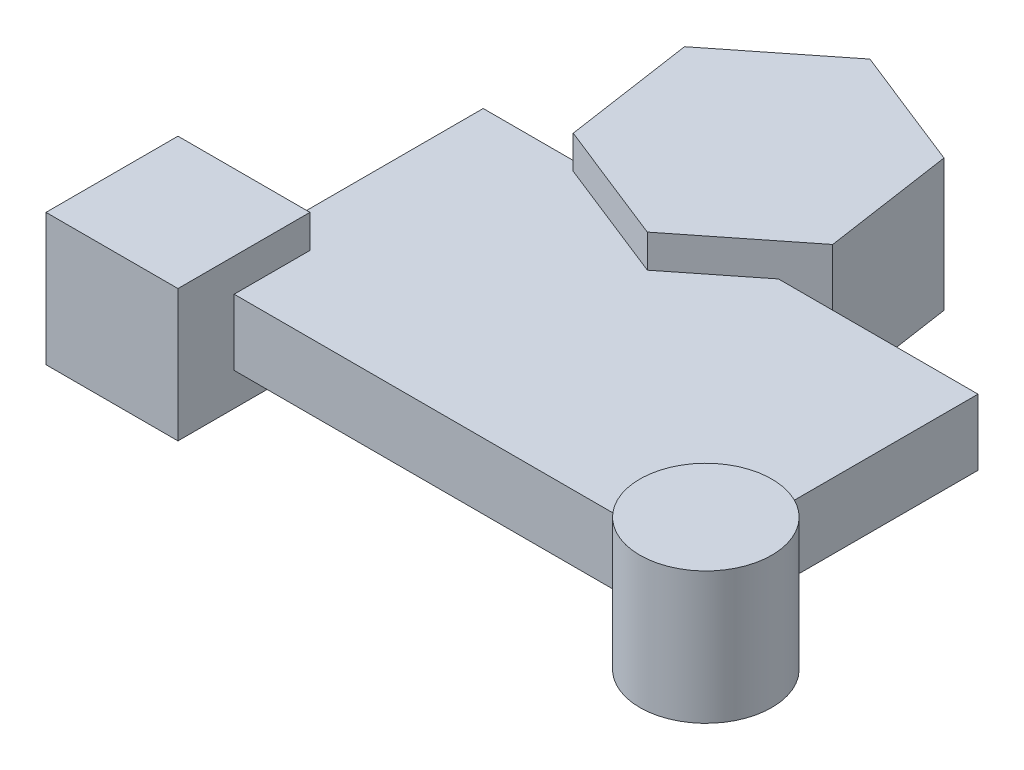
ISO-10303-21;
HEADER;
FILE_DESCRIPTION(('STEP AP214'),'2;1');
FILE_NAME('part.step','',(''),(''),'','','');
FILE_SCHEMA(('AUTOMOTIVE_DESIGN { 1 0 10303 214 1 1 1 1 }'));
ENDSEC;
DATA;
#1=APPLICATION_CONTEXT('core data for automotive mechanical design processes');
#2=APPLICATION_PROTOCOL_DEFINITION('international standard','automotive_design',2000,#1);
#3=PRODUCT_CONTEXT('',#1,'mechanical');
#4=PRODUCT('Part','Part','',(#3));
#5=PRODUCT_RELATED_PRODUCT_CATEGORY('part','',(#4));
#6=PRODUCT_DEFINITION_FORMATION('','',#4);
#7=PRODUCT_DEFINITION_CONTEXT('part definition',#1,'design');
#8=PRODUCT_DEFINITION('design','',#6,#7);
#9=PRODUCT_DEFINITION_SHAPE('','',#8);
#10=(LENGTH_UNIT() NAMED_UNIT(*) SI_UNIT(.MILLI.,.METRE.));
#11=(NAMED_UNIT(*) PLANE_ANGLE_UNIT() SI_UNIT($,.RADIAN.));
#12=(NAMED_UNIT(*) SI_UNIT($,.STERADIAN.) SOLID_ANGLE_UNIT());
#13=UNCERTAINTY_MEASURE_WITH_UNIT(LENGTH_MEASURE(1.E-05),#10,'distance_accuracy_value','');
#14=(GEOMETRIC_REPRESENTATION_CONTEXT(3) GLOBAL_UNCERTAINTY_ASSIGNED_CONTEXT((#13)) GLOBAL_UNIT_ASSIGNED_CONTEXT((#10,
#11,#12)) REPRESENTATION_CONTEXT('',''));
#15=CARTESIAN_POINT('',(0.,0.,0.));
#16=DIRECTION('',(0.,0.,1.));
#17=DIRECTION('',(1.,0.,0.));
#18=AXIS2_PLACEMENT_3D('',#15,#16,#17);
#19=CARTESIAN_POINT('',(4.78052116498155,10.,-15.1706895412915));
#20=DIRECTION('',(0.368239357538517,0.,-0.929731023231784));
#21=DIRECTION('',(-0.929731023231784,0.,-0.368239357538517));
#22=AXIS2_PLACEMENT_3D('',#19,#20,#21);
#23=PLANE('',#22);
#24=DIRECTION('',(0.929731023231784,0.,0.368239357538517));
#25=VECTOR('',#24,1.);
#26=CARTESIAN_POINT('',(4.78052116498155,2.5,-15.1706895412915));
#27=LINE('',#26,#25);
#28=CARTESIAN_POINT('',(4.78052116498155,2.5,-15.1706895412915));
#29=VERTEX_POINT('',#28);
#30=CARTESIAN_POINT('',(14.0778313972994,2.5,-11.4882959659064));
#31=VERTEX_POINT('',#30);
#32=EDGE_CURVE('E64',#29,#31,#27,.T.);
#33=ORIENTED_EDGE('',*,*,#32,.F.);
#34=DIRECTION('',(0.,-1.,0.));
#35=VECTOR('',#34,1.);
#36=CARTESIAN_POINT('',(4.78052116498155,10.,-15.1706895412915));
#37=LINE('',#36,#35);
#38=CARTESIAN_POINT('',(4.78052116498155,0.,-15.1706895412915));
#39=VERTEX_POINT('',#38);
#40=EDGE_CURVE('E138',#29,#39,#37,.T.);
#41=ORIENTED_EDGE('',*,*,#40,.T.);
#42=DIRECTION('',(0.929731023231784,0.,0.368239357538517));
#43=VECTOR('',#42,1.);
#44=CARTESIAN_POINT('',(4.78052116498155,0.,-15.1706895412915));
#45=LINE('',#44,#43);
#46=CARTESIAN_POINT('',(14.0778313972994,0.,-11.4882959659064));
#47=VERTEX_POINT('',#46);
#48=EDGE_CURVE('E157',#39,#47,#45,.T.);
#49=ORIENTED_EDGE('',*,*,#48,.T.);
#50=DIRECTION('',(0.,-1.,0.));
#51=VECTOR('',#50,1.);
#52=CARTESIAN_POINT('',(14.0778313972994,10.,-11.4882959659064));
#53=LINE('',#52,#51);
#54=EDGE_CURVE('E139',#31,#47,#53,.T.);
#55=ORIENTED_EDGE('',*,*,#54,.F.);
#56=EDGE_LOOP('',(#33,#41,#49,#55));
#57=FACE_BOUND('',#56,.T.);
#58=ADVANCED_FACE('F49',(#57),#23,.F.);
#59=CARTESIAN_POINT('',(20.4559241633317,10.,-27.5917096620109));
#60=DIRECTION('',(-0.368239357538516,0.,0.929731023231784));
#61=DIRECTION('',(0.929731023231784,0.,0.368239357538516));
#62=AXIS2_PLACEMENT_3D('',#59,#60,#61);
#63=PLANE('',#62);
#64=DIRECTION('',(-0.929731023231784,0.,-0.368239357538516));
#65=VECTOR('',#64,1.);
#66=CARTESIAN_POINT('',(20.4559241633317,0.,-27.5917096620109));
#67=LINE('',#66,#65);
#68=CARTESIAN_POINT('',(20.4559241633317,0.,-27.5917096620109));
#69=VERTEX_POINT('',#68);
#70=CARTESIAN_POINT('',(11.1586139310139,0.,-31.274103237396));
#71=VERTEX_POINT('',#70);
#72=EDGE_CURVE('E148',#69,#71,#67,.T.);
#73=ORIENTED_EDGE('',*,*,#72,.T.);
#74=DIRECTION('',(0.,-1.,0.));
#75=VECTOR('',#74,1.);
#76=CARTESIAN_POINT('',(11.1586139310139,10.,-31.274103237396));
#77=LINE('',#76,#75);
#78=CARTESIAN_POINT('',(11.1586139310139,10.,-31.274103237396));
#79=VERTEX_POINT('',#78);
#80=EDGE_CURVE('E171',#79,#71,#77,.T.);
#81=ORIENTED_EDGE('',*,*,#80,.F.);
#82=DIRECTION('',(-0.929731023231784,0.,-0.368239357538516));
#83=VECTOR('',#82,1.);
#84=CARTESIAN_POINT('',(20.4559241633317,10.,-27.5917096620109));
#85=LINE('',#84,#83);
#86=CARTESIAN_POINT('',(20.4559241633317,10.,-27.5917096620109));
#87=VERTEX_POINT('',#86);
#88=EDGE_CURVE('E163',#87,#79,#85,.T.);
#89=ORIENTED_EDGE('',*,*,#88,.F.);
#90=DIRECTION('',(0.,-1.,0.));
#91=VECTOR('',#90,1.);
#92=CARTESIAN_POINT('',(20.4559241633317,10.,-27.5917096620109));
#93=LINE('',#92,#91);
#94=EDGE_CURVE('E144',#87,#69,#93,.T.);
#95=ORIENTED_EDGE('',*,*,#94,.T.);
#96=EDGE_LOOP('',(#73,#81,#89,#95));
#97=FACE_BOUND('',#96,.T.);
#98=ADVANCED_FACE('F51',(#97),#63,.F.);
#99=CARTESIAN_POINT('',(11.1586139310139,10.,-31.274103237396));
#100=DIRECTION('',(0.621051006035967,0.,0.783770149917508));
#101=DIRECTION('',(0.783770149917508,0.,-0.621051006035967));
#102=AXIS2_PLACEMENT_3D('',#99,#100,#101);
#103=PLANE('',#102);
#104=DIRECTION('',(-0.783770149917508,0.,0.621051006035967));
#105=VECTOR('',#104,1.);
#106=CARTESIAN_POINT('',(11.1586139310139,0.,-31.274103237396));
#107=LINE('',#106,#105);
#108=CARTESIAN_POINT('',(3.32091243183879,0.,-25.0635931770364));
#109=VERTEX_POINT('',#108);
#110=EDGE_CURVE('E151',#71,#109,#107,.T.);
#111=ORIENTED_EDGE('',*,*,#110,.T.);
#112=DIRECTION('',(0.,-1.,0.));
#113=VECTOR('',#112,1.);
#114=CARTESIAN_POINT('',(3.32091243183879,10.,-25.0635931770364));
#115=LINE('',#114,#113);
#116=CARTESIAN_POINT('',(3.32091243183879,10.,-25.0635931770364));
#117=VERTEX_POINT('',#116);
#118=EDGE_CURVE('E168',#117,#109,#115,.T.);
#119=ORIENTED_EDGE('',*,*,#118,.F.);
#120=DIRECTION('',(-0.783770149917508,0.,0.621051006035967));
#121=VECTOR('',#120,1.);
#122=CARTESIAN_POINT('',(11.1586139310139,10.,-31.274103237396));
#123=LINE('',#122,#121);
#124=EDGE_CURVE('E109',#79,#117,#123,.T.);
#125=ORIENTED_EDGE('',*,*,#124,.F.);
#126=ORIENTED_EDGE('',*,*,#80,.T.);
#127=EDGE_LOOP('',(#111,#119,#125,#126));
#128=FACE_BOUND('',#127,.T.);
#129=ADVANCED_FACE('F209',(#128),#103,.F.);
#130=CARTESIAN_POINT('',(3.32091243183879,10.,-25.0635931770364));
#131=DIRECTION('',(0.989290363574483,0.,-0.145960873314276));
#132=DIRECTION('',(-0.145960873314276,0.,-0.989290363574484));
#133=AXIS2_PLACEMENT_3D('',#130,#131,#132);
#134=PLANE('',#133);
#135=DIRECTION('',(0.,-1.,0.));
#136=VECTOR('',#135,1.);
#137=CARTESIAN_POINT('',(4.67558760680807,10.,-15.8819058800229));
#138=LINE('',#137,#136);
#139=CARTESIAN_POINT('',(4.67558760680807,7.5,-15.8819058800229));
#140=VERTEX_POINT('',#139);
#141=CARTESIAN_POINT('',(4.67558760680807,2.5,-15.8819058800229));
#142=VERTEX_POINT('',#141);
#143=EDGE_CURVE('E152',#140,#142,#138,.T.);
#144=ORIENTED_EDGE('',*,*,#143,.F.);
#145=DIRECTION('',(0.145960873314276,0.,0.989290363574484));
#146=VECTOR('',#145,1.);
#147=CARTESIAN_POINT('',(3.32091243183879,7.5,-25.0635931770364));
#148=LINE('',#147,#146);
#149=CARTESIAN_POINT('',(4.78052116498155,7.5,-15.1706895412915));
#150=VERTEX_POINT('',#149);
#151=EDGE_CURVE('E196',#140,#150,#148,.T.);
#152=ORIENTED_EDGE('',*,*,#151,.T.);
#153=CARTESIAN_POINT('',(4.78052116498155,10.,-15.1706895412915));
#154=VERTEX_POINT('',#153);
#155=EDGE_CURVE('E166',#154,#150,#37,.T.);
#156=ORIENTED_EDGE('',*,*,#155,.F.);
#157=DIRECTION('',(0.145960873314276,0.,0.989290363574484));
#158=VECTOR('',#157,1.);
#159=CARTESIAN_POINT('',(3.32091243183879,10.,-25.0635931770364));
#160=LINE('',#159,#158);
#161=EDGE_CURVE('E125',#117,#154,#160,.T.);
#162=ORIENTED_EDGE('',*,*,#161,.F.);
#163=ORIENTED_EDGE('',*,*,#118,.T.);
#164=DIRECTION('',(0.145960873314276,0.,0.989290363574484));
#165=VECTOR('',#164,1.);
#166=CARTESIAN_POINT('',(3.32091243183879,0.,-25.0635931770364));
#167=LINE('',#166,#165);
#168=EDGE_CURVE('E154',#109,#39,#167,.T.);
#169=ORIENTED_EDGE('',*,*,#168,.T.);
#170=ORIENTED_EDGE('',*,*,#40,.F.);
#171=DIRECTION('',(0.145960873314276,0.,0.989290363574484));
#172=VECTOR('',#171,1.);
#173=CARTESIAN_POINT('',(3.32091243183879,2.5,-25.0635931770364));
#174=LINE('',#173,#172);
#175=EDGE_CURVE('E198',#142,#29,#174,.T.);
#176=ORIENTED_EDGE('',*,*,#175,.F.);
#177=EDGE_LOOP('',(#144,#152,#156,#162,#163,#169,#170,#176));
#178=FACE_BOUND('',#177,.T.);
#179=ADVANCED_FACE('F212',(#178),#134,.F.);
#180=ORIENTED_EDGE('',*,*,#155,.T.);
#181=DIRECTION('',(0.929731023231784,0.,0.368239357538517));
#182=VECTOR('',#181,1.);
#183=CARTESIAN_POINT('',(4.78052116498155,7.5,-15.1706895412915));
#184=LINE('',#183,#182);
#185=CARTESIAN_POINT('',(14.0778313972994,7.5,-11.4882959659064));
#186=VERTEX_POINT('',#185);
#187=EDGE_CURVE('E136',#150,#186,#184,.T.);
#188=ORIENTED_EDGE('',*,*,#187,.T.);
#189=CARTESIAN_POINT('',(14.0778313972994,10.,-11.4882959659064));
#190=VERTEX_POINT('',#189);
#191=EDGE_CURVE('E132',#190,#186,#53,.T.);
#192=ORIENTED_EDGE('',*,*,#191,.F.);
#193=DIRECTION('',(0.929731023231784,0.,0.368239357538517));
#194=VECTOR('',#193,1.);
#195=CARTESIAN_POINT('',(4.78052116498155,10.,-15.1706895412915));
#196=LINE('',#195,#194);
#197=EDGE_CURVE('E118',#154,#190,#196,.T.);
#198=ORIENTED_EDGE('',*,*,#197,.F.);
#199=EDGE_LOOP('',(#180,#188,#192,#198));
#200=FACE_BOUND('',#199,.T.);
#201=ADVANCED_FACE('F133',(#200),#23,.F.);
#202=CARTESIAN_POINT('',(14.0778313972994,10.,-11.4882959659064));
#203=DIRECTION('',(-0.621051006035967,0.,-0.783770149917508));
#204=DIRECTION('',(-0.783770149917508,0.,0.621051006035967));
#205=AXIS2_PLACEMENT_3D('',#202,#203,#204);
#206=PLANE('',#205);
#207=ORIENTED_EDGE('',*,*,#191,.T.);
#208=DIRECTION('',(0.783770149917508,0.,-0.621051006035967));
#209=VECTOR('',#208,1.);
#210=CARTESIAN_POINT('',(14.0778313972994,7.5,-11.4882959659064));
#211=LINE('',#210,#209);
#212=CARTESIAN_POINT('',(19.6225938525537,7.5,-15.8819058800229));
#213=VERTEX_POINT('',#212);
#214=EDGE_CURVE('E12',#186,#213,#211,.T.);
#215=ORIENTED_EDGE('',*,*,#214,.T.);
#216=DIRECTION('',(0.,1.,0.));
#217=VECTOR('',#216,1.);
#218=CARTESIAN_POINT('',(19.6225938525537,10.,-15.8819058800229));
#219=LINE('',#218,#217);
#220=CARTESIAN_POINT('',(19.6225938525537,2.5,-15.8819058800229));
#221=VERTEX_POINT('',#220);
#222=EDGE_CURVE('E57',#221,#213,#219,.T.);
#223=ORIENTED_EDGE('',*,*,#222,.F.);
#224=DIRECTION('',(0.783770149917508,0.,-0.621051006035967));
#225=VECTOR('',#224,1.);
#226=CARTESIAN_POINT('',(14.0778313972994,2.5,-11.4882959659064));
#227=LINE('',#226,#225);
#228=EDGE_CURVE('E173',#31,#221,#227,.T.);
#229=ORIENTED_EDGE('',*,*,#228,.F.);
#230=ORIENTED_EDGE('',*,*,#54,.T.);
#231=DIRECTION('',(0.783770149917508,0.,-0.621051006035967));
#232=VECTOR('',#231,1.);
#233=CARTESIAN_POINT('',(14.0778313972994,0.,-11.4882959659064));
#234=LINE('',#233,#232);
#235=CARTESIAN_POINT('',(21.9155328964745,0.,-17.6988060262661));
#236=VERTEX_POINT('',#235);
#237=EDGE_CURVE('E160',#47,#236,#234,.T.);
#238=ORIENTED_EDGE('',*,*,#237,.T.);
#239=DIRECTION('',(0.,-1.,0.));
#240=VECTOR('',#239,1.);
#241=CARTESIAN_POINT('',(21.9155328964745,10.,-17.6988060262661));
#242=LINE('',#241,#240);
#243=CARTESIAN_POINT('',(21.9155328964745,10.,-17.6988060262661));
#244=VERTEX_POINT('',#243);
#245=EDGE_CURVE('E142',#244,#236,#242,.T.);
#246=ORIENTED_EDGE('',*,*,#245,.F.);
#247=DIRECTION('',(0.783770149917508,0.,-0.621051006035967));
#248=VECTOR('',#247,1.);
#249=CARTESIAN_POINT('',(14.0778313972994,10.,-11.4882959659064));
#250=LINE('',#249,#248);
#251=EDGE_CURVE('E122',#190,#244,#250,.T.);
#252=ORIENTED_EDGE('',*,*,#251,.F.);
#253=EDGE_LOOP('',(#207,#215,#223,#229,#230,#238,#246,#252));
#254=FACE_BOUND('',#253,.T.);
#255=ADVANCED_FACE('F141',(#254),#206,.F.);
#256=CARTESIAN_POINT('',(21.9155328964745,10.,-17.6988060262661));
#257=DIRECTION('',(-0.989290363574484,0.,0.145960873314276));
#258=DIRECTION('',(0.145960873314276,0.,0.989290363574484));
#259=AXIS2_PLACEMENT_3D('',#256,#257,#258);
#260=PLANE('',#259);
#261=DIRECTION('',(-0.145960873314276,0.,-0.989290363574484));
#262=VECTOR('',#261,1.);
#263=CARTESIAN_POINT('',(21.9155328964745,0.,-17.6988060262661));
#264=LINE('',#263,#262);
#265=EDGE_CURVE('E100',#236,#69,#264,.T.);
#266=ORIENTED_EDGE('',*,*,#265,.T.);
#267=ORIENTED_EDGE('',*,*,#94,.F.);
#268=DIRECTION('',(-0.145960873314276,0.,-0.989290363574484));
#269=VECTOR('',#268,1.);
#270=CARTESIAN_POINT('',(21.9155328964745,10.,-17.6988060262661));
#271=LINE('',#270,#269);
#272=EDGE_CURVE('E73',#244,#87,#271,.T.);
#273=ORIENTED_EDGE('',*,*,#272,.F.);
#274=ORIENTED_EDGE('',*,*,#245,.T.);
#275=EDGE_LOOP('',(#266,#267,#273,#274));
#276=FACE_BOUND('',#275,.T.);
#277=ADVANCED_FACE('F228',(#276),#260,.F.);
#278=CARTESIAN_POINT('',(0.,10.,0.));
#279=DIRECTION('',(0.,1.,0.));
#280=DIRECTION('',(0.,0.,1.));
#281=AXIS2_PLACEMENT_3D('',#278,#279,#280);
#282=PLANE('',#281);
#283=ORIENTED_EDGE('',*,*,#88,.T.);
#284=ORIENTED_EDGE('',*,*,#124,.T.);
#285=ORIENTED_EDGE('',*,*,#161,.T.);
#286=ORIENTED_EDGE('',*,*,#197,.T.);
#287=ORIENTED_EDGE('',*,*,#251,.T.);
#288=ORIENTED_EDGE('',*,*,#272,.T.);
#289=EDGE_LOOP('',(#283,#284,#285,#286,#287,#288));
#290=FACE_BOUND('',#289,.T.);
#291=ADVANCED_FACE('F120',(#290),#282,.T.);
#292=CARTESIAN_POINT('',(0.,0.,0.));
#293=DIRECTION('',(0.,1.,0.));
#294=DIRECTION('',(0.,0.,1.));
#295=AXIS2_PLACEMENT_3D('',#292,#293,#294);
#296=PLANE('',#295);
#297=ORIENTED_EDGE('',*,*,#72,.F.);
#298=ORIENTED_EDGE('',*,*,#265,.F.);
#299=ORIENTED_EDGE('',*,*,#237,.F.);
#300=ORIENTED_EDGE('',*,*,#48,.F.);
#301=ORIENTED_EDGE('',*,*,#168,.F.);
#302=ORIENTED_EDGE('',*,*,#110,.F.);
#303=EDGE_LOOP('',(#297,#298,#299,#300,#301,#302));
#304=FACE_BOUND('',#303,.T.);
#305=ADVANCED_FACE('F227',(#304),#296,.F.);
#306=CARTESIAN_POINT('',(-2.75181442294586,7.5,-15.8819058800229));
#307=DIRECTION('',(0.,0.,1.));
#308=DIRECTION('',(1.,0.,0.));
#309=AXIS2_PLACEMENT_3D('',#306,#307,#308);
#310=PLANE('',#309);
#311=ORIENTED_EDGE('',*,*,#143,.T.);
#312=DIRECTION('',(-1.,0.,0.));
#313=VECTOR('',#312,1.);
#314=CARTESIAN_POINT('',(-2.75181442294586,2.5,-15.8819058800229));
#315=LINE('',#314,#313);
#316=EDGE_CURVE('E188',#221,#142,#315,.T.);
#317=ORIENTED_EDGE('',*,*,#316,.F.);
#318=ORIENTED_EDGE('',*,*,#222,.T.);
#319=DIRECTION('',(-1.,0.,0.));
#320=VECTOR('',#319,1.);
#321=CARTESIAN_POINT('',(-2.75181442294586,7.5,-15.8819058800229));
#322=LINE('',#321,#320);
#323=EDGE_CURVE('E184',#213,#140,#322,.T.);
#324=ORIENTED_EDGE('',*,*,#323,.T.);
#325=EDGE_LOOP('',(#311,#317,#318,#324));
#326=FACE_BOUND('',#325,.T.);
#327=ADVANCED_FACE('F182',(#326),#310,.T.);
#328=CARTESIAN_POINT('',(0.,7.5,0.));
#329=DIRECTION('',(0.,1.,0.));
#330=DIRECTION('',(0.,0.,1.));
#331=AXIS2_PLACEMENT_3D('',#328,#329,#330);
#332=PLANE('',#331);
#333=ORIENTED_EDGE('',*,*,#323,.F.);
#334=ORIENTED_EDGE('',*,*,#214,.F.);
#335=ORIENTED_EDGE('',*,*,#187,.F.);
#336=ORIENTED_EDGE('',*,*,#151,.F.);
#337=EDGE_LOOP('',(#333,#334,#335,#336));
#338=FACE_BOUND('',#337,.T.);
#339=ADVANCED_FACE('F194',(#338),#332,.F.);
#340=CARTESIAN_POINT('',(0.,2.5,0.));
#341=DIRECTION('',(0.,1.,0.));
#342=DIRECTION('',(0.,0.,1.));
#343=AXIS2_PLACEMENT_3D('',#340,#341,#342);
#344=PLANE('',#343);
#345=ORIENTED_EDGE('',*,*,#175,.T.);
#346=ORIENTED_EDGE('',*,*,#32,.T.);
#347=ORIENTED_EDGE('',*,*,#228,.T.);
#348=ORIENTED_EDGE('',*,*,#316,.T.);
#349=EDGE_LOOP('',(#345,#346,#347,#348));
#350=FACE_BOUND('',#349,.T.);
#351=ADVANCED_FACE('F218',(#350),#344,.T.);
#352=CLOSED_SHELL('',(#58,#98,#129,#179,#201,#255,#277,#291,#305,#327,#339,#351));
#353=MANIFOLD_SOLID_BREP('B2',#352);
#354=CARTESIAN_POINT('',(-10.,10.,10.));
#355=DIRECTION('',(1.,0.,0.));
#356=DIRECTION('',(0.,0.,-1.));
#357=AXIS2_PLACEMENT_3D('',#354,#355,#356);
#358=PLANE('',#357);
#359=DIRECTION('',(0.,0.,1.));
#360=VECTOR('',#359,1.);
#361=CARTESIAN_POINT('',(-10.,0.,10.));
#362=LINE('',#361,#360);
#363=CARTESIAN_POINT('',(-10.,0.,0.));
#364=VERTEX_POINT('',#363);
#365=CARTESIAN_POINT('',(-10.,0.,10.));
#366=VERTEX_POINT('',#365);
#367=EDGE_CURVE('E435',#364,#366,#362,.T.);
#368=ORIENTED_EDGE('',*,*,#367,.T.);
#369=DIRECTION('',(0.,-1.,0.));
#370=VECTOR('',#369,1.);
#371=CARTESIAN_POINT('',(-10.,10.,10.));
#372=LINE('',#371,#370);
#373=CARTESIAN_POINT('',(-10.,10.,10.));
#374=VERTEX_POINT('',#373);
#375=EDGE_CURVE('E459',#374,#366,#372,.T.);
#376=ORIENTED_EDGE('',*,*,#375,.F.);
#377=DIRECTION('',(0.,0.,1.));
#378=VECTOR('',#377,1.);
#379=CARTESIAN_POINT('',(-10.,10.,10.));
#380=LINE('',#379,#378);
#381=CARTESIAN_POINT('',(-10.,10.,0.));
#382=VERTEX_POINT('',#381);
#383=EDGE_CURVE('E436',#382,#374,#380,.T.);
#384=ORIENTED_EDGE('',*,*,#383,.F.);
#385=DIRECTION('',(0.,-1.,0.));
#386=VECTOR('',#385,1.);
#387=CARTESIAN_POINT('',(-10.,10.,0.));
#388=LINE('',#387,#386);
#389=EDGE_CURVE('E442',#382,#364,#388,.T.);
#390=ORIENTED_EDGE('',*,*,#389,.T.);
#391=EDGE_LOOP('',(#368,#376,#384,#390));
#392=FACE_BOUND('',#391,.T.);
#393=ADVANCED_FACE('F334',(#392),#358,.F.);
#394=CARTESIAN_POINT('',(-10.,10.,10.));
#395=DIRECTION('',(0.,0.,-1.));
#396=DIRECTION('',(-1.,0.,0.));
#397=AXIS2_PLACEMENT_3D('',#394,#395,#396);
#398=PLANE('',#397);
#399=DIRECTION('',(1.,0.,0.));
#400=VECTOR('',#399,1.);
#401=CARTESIAN_POINT('',(-10.,0.,10.));
#402=LINE('',#401,#400);
#403=CARTESIAN_POINT('',(0.,0.,10.));
#404=VERTEX_POINT('',#403);
#405=EDGE_CURVE('E445',#366,#404,#402,.T.);
#406=ORIENTED_EDGE('',*,*,#405,.T.);
#407=DIRECTION('',(0.,-1.,0.));
#408=VECTOR('',#407,1.);
#409=CARTESIAN_POINT('',(0.,10.,10.));
#410=LINE('',#409,#408);
#411=CARTESIAN_POINT('',(0.,10.,10.));
#412=VERTEX_POINT('',#411);
#413=EDGE_CURVE('E456',#412,#404,#410,.T.);
#414=ORIENTED_EDGE('',*,*,#413,.F.);
#415=DIRECTION('',(1.,0.,0.));
#416=VECTOR('',#415,1.);
#417=CARTESIAN_POINT('',(-10.,10.,10.));
#418=LINE('',#417,#416);
#419=EDGE_CURVE('E385',#374,#412,#418,.T.);
#420=ORIENTED_EDGE('',*,*,#419,.F.);
#421=ORIENTED_EDGE('',*,*,#375,.T.);
#422=EDGE_LOOP('',(#406,#414,#420,#421));
#423=FACE_BOUND('',#422,.T.);
#424=ADVANCED_FACE('F479',(#423),#398,.F.);
#425=CARTESIAN_POINT('',(0.,10.,10.));
#426=DIRECTION('',(-1.,0.,0.));
#427=DIRECTION('',(0.,0.,1.));
#428=AXIS2_PLACEMENT_3D('',#425,#426,#427);
#429=PLANE('',#428);
#430=DIRECTION('',(0.,-1.,0.));
#431=VECTOR('',#430,1.);
#432=CARTESIAN_POINT('',(0.,10.,5.74303168974751));
#433=LINE('',#432,#431);
#434=CARTESIAN_POINT('',(0.,7.5,5.74303168974751));
#435=VERTEX_POINT('',#434);
#436=CARTESIAN_POINT('',(0.,2.5,5.74303168974751));
#437=VERTEX_POINT('',#436);
#438=EDGE_CURVE('E47',#435,#437,#433,.T.);
#439=ORIENTED_EDGE('',*,*,#438,.F.);
#440=DIRECTION('',(0.,0.,-1.));
#441=VECTOR('',#440,1.);
#442=CARTESIAN_POINT('',(0.,7.5,10.));
#443=LINE('',#442,#441);
#444=CARTESIAN_POINT('',(0.,7.5,0.));
#445=VERTEX_POINT('',#444);
#446=EDGE_CURVE('E423',#435,#445,#443,.T.);
#447=ORIENTED_EDGE('',*,*,#446,.T.);
#448=DIRECTION('',(0.,-1.,0.));
#449=VECTOR('',#448,1.);
#450=CARTESIAN_POINT('',(0.,10.,0.));
#451=LINE('',#450,#449);
#452=CARTESIAN_POINT('',(0.,10.,0.));
#453=VERTEX_POINT('',#452);
#454=EDGE_CURVE('E453',#453,#445,#451,.T.);
#455=ORIENTED_EDGE('',*,*,#454,.F.);
#456=DIRECTION('',(0.,0.,-1.));
#457=VECTOR('',#456,1.);
#458=CARTESIAN_POINT('',(0.,10.,10.));
#459=LINE('',#458,#457);
#460=EDGE_CURVE('E439',#412,#453,#459,.T.);
#461=ORIENTED_EDGE('',*,*,#460,.F.);
#462=ORIENTED_EDGE('',*,*,#413,.T.);
#463=DIRECTION('',(0.,0.,-1.));
#464=VECTOR('',#463,1.);
#465=CARTESIAN_POINT('',(0.,0.,10.));
#466=LINE('',#465,#464);
#467=CARTESIAN_POINT('',(0.,0.,0.));
#468=VERTEX_POINT('',#467);
#469=EDGE_CURVE('E447',#404,#468,#466,.T.);
#470=ORIENTED_EDGE('',*,*,#469,.T.);
#471=CARTESIAN_POINT('',(0.,2.5,0.));
#472=VERTEX_POINT('',#471);
#473=EDGE_CURVE('E452',#472,#468,#451,.T.);
#474=ORIENTED_EDGE('',*,*,#473,.F.);
#475=DIRECTION('',(0.,0.,-1.));
#476=VECTOR('',#475,1.);
#477=CARTESIAN_POINT('',(0.,2.5,10.));
#478=LINE('',#477,#476);
#479=EDGE_CURVE('E348',#437,#472,#478,.T.);
#480=ORIENTED_EDGE('',*,*,#479,.F.);
#481=EDGE_LOOP('',(#439,#447,#455,#461,#462,#470,#474,#480));
#482=FACE_BOUND('',#481,.T.);
#483=ADVANCED_FACE('F466',(#482),#429,.F.);
#484=CARTESIAN_POINT('',(-10.,10.,0.));
#485=DIRECTION('',(0.,0.,1.));
#486=DIRECTION('',(1.,0.,0.));
#487=AXIS2_PLACEMENT_3D('',#484,#485,#486);
#488=PLANE('',#487);
#489=ORIENTED_EDGE('',*,*,#454,.T.);
#490=DIRECTION('',(-1.,0.,0.));
#491=VECTOR('',#490,1.);
#492=CARTESIAN_POINT('',(-10.,7.5,0.));
#493=LINE('',#492,#491);
#494=CARTESIAN_POINT('',(-2.75181442294586,7.5,0.));
#495=VERTEX_POINT('',#494);
#496=EDGE_CURVE('E341',#445,#495,#493,.T.);
#497=ORIENTED_EDGE('',*,*,#496,.T.);
#498=DIRECTION('',(0.,1.,0.));
#499=VECTOR('',#498,1.);
#500=CARTESIAN_POINT('',(-2.75181442294586,10.,0.));
#501=LINE('',#500,#499);
#502=CARTESIAN_POINT('',(-2.75181442294586,2.5,0.));
#503=VERTEX_POINT('',#502);
#504=EDGE_CURVE('E414',#503,#495,#501,.T.);
#505=ORIENTED_EDGE('',*,*,#504,.F.);
#506=DIRECTION('',(-1.,0.,0.));
#507=VECTOR('',#506,1.);
#508=CARTESIAN_POINT('',(-10.,2.5,0.));
#509=LINE('',#508,#507);
#510=EDGE_CURVE('E461',#472,#503,#509,.T.);
#511=ORIENTED_EDGE('',*,*,#510,.F.);
#512=ORIENTED_EDGE('',*,*,#473,.T.);
#513=DIRECTION('',(-1.,0.,0.));
#514=VECTOR('',#513,1.);
#515=CARTESIAN_POINT('',(-10.,0.,0.));
#516=LINE('',#515,#514);
#517=EDGE_CURVE('E377',#468,#364,#516,.T.);
#518=ORIENTED_EDGE('',*,*,#517,.T.);
#519=ORIENTED_EDGE('',*,*,#389,.F.);
#520=DIRECTION('',(-1.,0.,0.));
#521=VECTOR('',#520,1.);
#522=CARTESIAN_POINT('',(-10.,10.,0.));
#523=LINE('',#522,#521);
#524=EDGE_CURVE('E357',#453,#382,#523,.T.);
#525=ORIENTED_EDGE('',*,*,#524,.F.);
#526=EDGE_LOOP('',(#489,#497,#505,#511,#512,#518,#519,#525));
#527=FACE_BOUND('',#526,.T.);
#528=ADVANCED_FACE('F463',(#527),#488,.F.);
#529=CARTESIAN_POINT('',(0.,10.,0.));
#530=DIRECTION('',(0.,-1.,0.));
#531=DIRECTION('',(0.,0.,-1.));
#532=AXIS2_PLACEMENT_3D('',#529,#530,#531);
#533=PLANE('',#532);
#534=ORIENTED_EDGE('',*,*,#383,.T.);
#535=ORIENTED_EDGE('',*,*,#419,.T.);
#536=ORIENTED_EDGE('',*,*,#460,.T.);
#537=ORIENTED_EDGE('',*,*,#524,.T.);
#538=EDGE_LOOP('',(#534,#535,#536,#537));
#539=FACE_BOUND('',#538,.T.);
#540=ADVANCED_FACE('F478',(#539),#533,.F.);
#541=CARTESIAN_POINT('',(0.,0.,0.));
#542=DIRECTION('',(0.,-1.,0.));
#543=DIRECTION('',(0.,0.,-1.));
#544=AXIS2_PLACEMENT_3D('',#541,#542,#543);
#545=PLANE('',#544);
#546=ORIENTED_EDGE('',*,*,#367,.F.);
#547=ORIENTED_EDGE('',*,*,#517,.F.);
#548=ORIENTED_EDGE('',*,*,#469,.F.);
#549=ORIENTED_EDGE('',*,*,#405,.F.);
#550=EDGE_LOOP('',(#546,#547,#548,#549));
#551=FACE_BOUND('',#550,.T.);
#552=ADVANCED_FACE('F474',(#551),#545,.T.);
#553=CARTESIAN_POINT('',(-2.75181442294586,7.5,5.74303168974751));
#554=DIRECTION('',(0.,0.,-1.));
#555=DIRECTION('',(-1.,0.,0.));
#556=AXIS2_PLACEMENT_3D('',#553,#554,#555);
#557=PLANE('',#556);
#558=ORIENTED_EDGE('',*,*,#438,.T.);
#559=DIRECTION('',(1.,0.,0.));
#560=VECTOR('',#559,1.);
#561=CARTESIAN_POINT('',(-2.75181442294586,2.5,5.74303168974751));
#562=LINE('',#561,#560);
#563=CARTESIAN_POINT('',(-2.75181442294586,2.5,5.74303168974751));
#564=VERTEX_POINT('',#563);
#565=EDGE_CURVE('E418',#564,#437,#562,.T.);
#566=ORIENTED_EDGE('',*,*,#565,.F.);
#567=DIRECTION('',(0.,-1.,0.));
#568=VECTOR('',#567,1.);
#569=CARTESIAN_POINT('',(-2.75181442294586,7.5,5.74303168974751));
#570=LINE('',#569,#568);
#571=CARTESIAN_POINT('',(-2.75181442294586,7.5,5.74303168974751));
#572=VERTEX_POINT('',#571);
#573=EDGE_CURVE('E412',#572,#564,#570,.T.);
#574=ORIENTED_EDGE('',*,*,#573,.F.);
#575=DIRECTION('',(1.,0.,0.));
#576=VECTOR('',#575,1.);
#577=CARTESIAN_POINT('',(-2.75181442294586,7.5,5.74303168974751));
#578=LINE('',#577,#576);
#579=EDGE_CURVE('E417',#572,#435,#578,.T.);
#580=ORIENTED_EDGE('',*,*,#579,.T.);
#581=EDGE_LOOP('',(#558,#566,#574,#580));
#582=FACE_BOUND('',#581,.T.);
#583=ADVANCED_FACE('F428',(#582),#557,.T.);
#584=CARTESIAN_POINT('',(-2.75181442294586,7.5,-15.8819058800229));
#585=DIRECTION('',(1.,0.,0.));
#586=DIRECTION('',(0.,0.,-1.));
#587=AXIS2_PLACEMENT_3D('',#584,#585,#586);
#588=PLANE('',#587);
#589=ORIENTED_EDGE('',*,*,#504,.T.);
#590=DIRECTION('',(0.,0.,1.));
#591=VECTOR('',#590,1.);
#592=CARTESIAN_POINT('',(-2.75181442294586,7.5,-15.8819058800229));
#593=LINE('',#592,#591);
#594=EDGE_CURVE('E407',#495,#572,#593,.T.);
#595=ORIENTED_EDGE('',*,*,#594,.T.);
#596=ORIENTED_EDGE('',*,*,#573,.T.);
#597=DIRECTION('',(0.,0.,1.));
#598=VECTOR('',#597,1.);
#599=CARTESIAN_POINT('',(-2.75181442294586,2.5,-15.8819058800229));
#600=LINE('',#599,#598);
#601=EDGE_CURVE('E470',#503,#564,#600,.T.);
#602=ORIENTED_EDGE('',*,*,#601,.F.);
#603=EDGE_LOOP('',(#589,#595,#596,#602));
#604=FACE_BOUND('',#603,.T.);
#605=ADVANCED_FACE('F409',(#604),#588,.T.);
#606=CARTESIAN_POINT('',(0.,7.5,0.));
#607=DIRECTION('',(0.,1.,0.));
#608=DIRECTION('',(0.,0.,1.));
#609=AXIS2_PLACEMENT_3D('',#606,#607,#608);
#610=PLANE('',#609);
#611=ORIENTED_EDGE('',*,*,#579,.F.);
#612=ORIENTED_EDGE('',*,*,#594,.F.);
#613=ORIENTED_EDGE('',*,*,#496,.F.);
#614=ORIENTED_EDGE('',*,*,#446,.F.);
#615=EDGE_LOOP('',(#611,#612,#613,#614));
#616=FACE_BOUND('',#615,.T.);
#617=ADVANCED_FACE('F421',(#616),#610,.F.);
#618=CARTESIAN_POINT('',(0.,2.5,0.));
#619=DIRECTION('',(0.,1.,0.));
#620=DIRECTION('',(0.,0.,1.));
#621=AXIS2_PLACEMENT_3D('',#618,#619,#620);
#622=PLANE('',#621);
#623=ORIENTED_EDGE('',*,*,#479,.T.);
#624=ORIENTED_EDGE('',*,*,#510,.T.);
#625=ORIENTED_EDGE('',*,*,#601,.T.);
#626=ORIENTED_EDGE('',*,*,#565,.T.);
#627=EDGE_LOOP('',(#623,#624,#625,#626));
#628=FACE_BOUND('',#627,.T.);
#629=ADVANCED_FACE('F469',(#628),#622,.T.);
#630=CLOSED_SHELL('',(#393,#424,#483,#528,#540,#552,#583,#605,#617,#629));
#631=MANIFOLD_SOLID_BREP('B6',#630);
#632=CARTESIAN_POINT('',(35.,10.,5.));
#633=DIRECTION('',(0.,-1.,0.));
#634=DIRECTION('',(0.,0.,-1.));
#635=AXIS2_PLACEMENT_3D('',#632,#633,#634);
#636=CYLINDRICAL_SURFACE('',#635,5.);
#637=DIRECTION('',(0.,-1.,0.));
#638=VECTOR('',#637,1.);
#639=CARTESIAN_POINT('',(34.7421693733974,10.,0.00665208822920715));
#640=LINE('',#639,#638);
#641=CARTESIAN_POINT('',(34.7421693733974,7.5,0.00665208822920715));
#642=VERTEX_POINT('',#641);
#643=CARTESIAN_POINT('',(34.7421693733974,2.5,0.00665208822920715));
#644=VERTEX_POINT('',#643);
#645=EDGE_CURVE('E577',#642,#644,#640,.T.);
#646=ORIENTED_EDGE('',*,*,#645,.F.);
#647=CARTESIAN_POINT('',(35.,7.5,5.));
#648=DIRECTION('',(0.,1.,0.));
#649=DIRECTION('',(0.,0.,1.));
#650=AXIS2_PLACEMENT_3D('',#647,#648,#649);
#651=CIRCLE('',#650,5.);
#652=CARTESIAN_POINT('',(30.0555178321658,7.5,5.74303168974751));
#653=VERTEX_POINT('',#652);
#654=EDGE_CURVE('E332',#642,#653,#651,.T.);
#655=ORIENTED_EDGE('',*,*,#654,.T.);
#656=DIRECTION('',(0.,-1.,0.));
#657=VECTOR('',#656,1.);
#658=CARTESIAN_POINT('',(30.0555178321658,10.,5.74303168974751));
#659=LINE('',#658,#657);
#660=CARTESIAN_POINT('',(30.0555178321658,2.5,5.74303168974751));
#661=VERTEX_POINT('',#660);
#662=EDGE_CURVE('E567',#661,#653,#659,.F.);
#663=ORIENTED_EDGE('',*,*,#662,.F.);
#664=CARTESIAN_POINT('',(35.,2.5,5.));
#665=DIRECTION('',(0.,1.,0.));
#666=DIRECTION('',(0.,0.,1.));
#667=AXIS2_PLACEMENT_3D('',#664,#665,#666);
#668=CIRCLE('',#667,5.);
#669=EDGE_CURVE('E637',#644,#661,#668,.T.);
#670=ORIENTED_EDGE('',*,*,#669,.F.);
#671=EDGE_LOOP('',(#646,#655,#663,#670));
#672=FACE_BOUND('',#671,.T.);
#673=CARTESIAN_POINT('',(35.,10.,5.));
#674=DIRECTION('',(0.,1.,0.));
#675=DIRECTION('',(0.,0.,1.));
#676=AXIS2_PLACEMENT_3D('',#673,#674,#675);
#677=CIRCLE('',#676,5.);
#678=CARTESIAN_POINT('',(35.,10.,10.));
#679=VERTEX_POINT('',#678);
#680=EDGE_CURVE('E629',#679,#679,#677,.T.);
#681=ORIENTED_EDGE('',*,*,#680,.F.);
#682=EDGE_LOOP('',(#681));
#683=FACE_BOUND('',#682,.T.);
#684=CARTESIAN_POINT('',(35.,0.,5.));
#685=DIRECTION('',(0.,1.,0.));
#686=DIRECTION('',(0.,0.,1.));
#687=AXIS2_PLACEMENT_3D('',#684,#685,#686);
#688=CIRCLE('',#687,5.);
#689=CARTESIAN_POINT('',(35.,0.,10.));
#690=VERTEX_POINT('',#689);
#691=EDGE_CURVE('E625',#690,#690,#688,.T.);
#692=ORIENTED_EDGE('',*,*,#691,.T.);
#693=EDGE_LOOP('',(#692));
#694=FACE_BOUND('',#693,.T.);
#695=ADVANCED_FACE('F560',(#672,#683,#694),#636,.T.);
#696=CARTESIAN_POINT('',(35.,10.,5.));
#697=DIRECTION('',(0.,1.,0.));
#698=DIRECTION('',(0.,0.,1.));
#699=AXIS2_PLACEMENT_3D('',#696,#697,#698);
#700=PLANE('',#699);
#701=ORIENTED_EDGE('',*,*,#680,.T.);
#702=EDGE_LOOP('',(#701));
#703=FACE_BOUND('',#702,.T.);
#704=ADVANCED_FACE('F670',(#703),#700,.T.);
#705=CARTESIAN_POINT('',(35.,0.,5.));
#706=DIRECTION('',(0.,1.,0.));
#707=DIRECTION('',(0.,0.,1.));
#708=AXIS2_PLACEMENT_3D('',#705,#706,#707);
#709=PLANE('',#708);
#710=ORIENTED_EDGE('',*,*,#691,.F.);
#711=EDGE_LOOP('',(#710));
#712=FACE_BOUND('',#711,.T.);
#713=ADVANCED_FACE('F674',(#712),#709,.F.);
#714=CARTESIAN_POINT('',(-2.75181442294586,7.5,5.74303168974751));
#715=DIRECTION('',(0.,0.,-1.));
#716=DIRECTION('',(-1.,0.,0.));
#717=AXIS2_PLACEMENT_3D('',#714,#715,#716);
#718=PLANE('',#717);
#719=DIRECTION('',(1.,0.,0.));
#720=VECTOR('',#719,1.);
#721=CARTESIAN_POINT('',(-2.75181442294586,2.5,5.74303168974751));
#722=LINE('',#721,#720);
#723=CARTESIAN_POINT('',(-2.75181442294586,2.5,5.74303168974751));
#724=VERTEX_POINT('',#723);
#725=EDGE_CURVE('E650',#724,#661,#722,.T.);
#726=ORIENTED_EDGE('',*,*,#725,.T.);
#727=ORIENTED_EDGE('',*,*,#662,.T.);
#728=DIRECTION('',(1.,0.,0.));
#729=VECTOR('',#728,1.);
#730=CARTESIAN_POINT('',(-2.75181442294586,7.5,5.74303168974751));
#731=LINE('',#730,#729);
#732=CARTESIAN_POINT('',(-2.75181442294586,7.5,5.74303168974751));
#733=VERTEX_POINT('',#732);
#734=EDGE_CURVE('E602',#733,#653,#731,.T.);
#735=ORIENTED_EDGE('',*,*,#734,.F.);
#736=DIRECTION('',(0.,-1.,0.));
#737=VECTOR('',#736,1.);
#738=CARTESIAN_POINT('',(-2.75181442294586,7.5,5.74303168974751));
#739=LINE('',#738,#737);
#740=EDGE_CURVE('E607',#733,#724,#739,.T.);
#741=ORIENTED_EDGE('',*,*,#740,.T.);
#742=EDGE_LOOP('',(#726,#727,#735,#741));
#743=FACE_BOUND('',#742,.T.);
#744=ADVANCED_FACE('F605',(#743),#718,.F.);
#745=CARTESIAN_POINT('',(34.7421693733974,7.5,-15.8819058800229));
#746=DIRECTION('',(-1.,0.,0.));
#747=DIRECTION('',(0.,0.,1.));
#748=AXIS2_PLACEMENT_3D('',#745,#746,#747);
#749=PLANE('',#748);
#750=DIRECTION('',(0.,0.,-1.));
#751=VECTOR('',#750,1.);
#752=CARTESIAN_POINT('',(34.7421693733974,7.5,-15.8819058800229));
#753=LINE('',#752,#751);
#754=CARTESIAN_POINT('',(34.7421693733974,7.5,-15.8819058800229));
#755=VERTEX_POINT('',#754);
#756=EDGE_CURVE('E610',#642,#755,#753,.T.);
#757=ORIENTED_EDGE('',*,*,#756,.F.);
#758=ORIENTED_EDGE('',*,*,#645,.T.);
#759=DIRECTION('',(0.,0.,-1.));
#760=VECTOR('',#759,1.);
#761=CARTESIAN_POINT('',(34.7421693733974,2.5,-15.8819058800229));
#762=LINE('',#761,#760);
#763=CARTESIAN_POINT('',(34.7421693733974,2.5,-15.8819058800229));
#764=VERTEX_POINT('',#763);
#765=EDGE_CURVE('E646',#644,#764,#762,.T.);
#766=ORIENTED_EDGE('',*,*,#765,.T.);
#767=DIRECTION('',(0.,-1.,0.));
#768=VECTOR('',#767,1.);
#769=CARTESIAN_POINT('',(34.7421693733974,7.5,-15.8819058800229));
#770=LINE('',#769,#768);
#771=EDGE_CURVE('E626',#755,#764,#770,.T.);
#772=ORIENTED_EDGE('',*,*,#771,.F.);
#773=EDGE_LOOP('',(#757,#758,#766,#772));
#774=FACE_BOUND('',#773,.T.);
#775=ADVANCED_FACE('F644',(#774),#749,.F.);
#776=CARTESIAN_POINT('',(-2.75181442294586,7.5,-15.8819058800229));
#777=DIRECTION('',(1.,0.,0.));
#778=DIRECTION('',(0.,0.,-1.));
#779=AXIS2_PLACEMENT_3D('',#776,#777,#778);
#780=PLANE('',#779);
#781=DIRECTION('',(0.,0.,1.));
#782=VECTOR('',#781,1.);
#783=CARTESIAN_POINT('',(-2.75181442294586,2.5,-15.8819058800229));
#784=LINE('',#783,#782);
#785=CARTESIAN_POINT('',(-2.75181442294586,2.5,-15.8819058800229));
#786=VERTEX_POINT('',#785);
#787=EDGE_CURVE('E624',#786,#724,#784,.T.);
#788=ORIENTED_EDGE('',*,*,#787,.T.);
#789=ORIENTED_EDGE('',*,*,#740,.F.);
#790=DIRECTION('',(0.,0.,1.));
#791=VECTOR('',#790,1.);
#792=CARTESIAN_POINT('',(-2.75181442294586,7.5,-15.8819058800229));
#793=LINE('',#792,#791);
#794=CARTESIAN_POINT('',(-2.75181442294586,7.5,-15.8819058800229));
#795=VERTEX_POINT('',#794);
#796=EDGE_CURVE('E611',#795,#733,#793,.T.);
#797=ORIENTED_EDGE('',*,*,#796,.F.);
#798=DIRECTION('',(0.,-1.,0.));
#799=VECTOR('',#798,1.);
#800=CARTESIAN_POINT('',(-2.75181442294586,7.5,-15.8819058800229));
#801=LINE('',#800,#799);
#802=EDGE_CURVE('E632',#795,#786,#801,.T.);
#803=ORIENTED_EDGE('',*,*,#802,.T.);
#804=EDGE_LOOP('',(#788,#789,#797,#803));
#805=FACE_BOUND('',#804,.T.);
#806=ADVANCED_FACE('F622',(#805),#780,.F.);
#807=CARTESIAN_POINT('',(-2.75181442294586,7.5,-15.8819058800229));
#808=DIRECTION('',(0.,0.,1.));
#809=DIRECTION('',(1.,0.,0.));
#810=AXIS2_PLACEMENT_3D('',#807,#808,#809);
#811=PLANE('',#810);
#812=DIRECTION('',(-1.,0.,0.));
#813=VECTOR('',#812,1.);
#814=CARTESIAN_POINT('',(-2.75181442294586,2.5,-15.8819058800229));
#815=LINE('',#814,#813);
#816=EDGE_CURVE('E620',#764,#786,#815,.T.);
#817=ORIENTED_EDGE('',*,*,#816,.T.);
#818=ORIENTED_EDGE('',*,*,#802,.F.);
#819=DIRECTION('',(-1.,0.,0.));
#820=VECTOR('',#819,1.);
#821=CARTESIAN_POINT('',(-2.75181442294586,7.5,-15.8819058800229));
#822=LINE('',#821,#820);
#823=EDGE_CURVE('E616',#755,#795,#822,.T.);
#824=ORIENTED_EDGE('',*,*,#823,.F.);
#825=ORIENTED_EDGE('',*,*,#771,.T.);
#826=EDGE_LOOP('',(#817,#818,#824,#825));
#827=FACE_BOUND('',#826,.T.);
#828=ADVANCED_FACE('F658',(#827),#811,.F.);
#829=CARTESIAN_POINT('',(0.,7.5,0.));
#830=DIRECTION('',(0.,1.,0.));
#831=DIRECTION('',(0.,0.,1.));
#832=AXIS2_PLACEMENT_3D('',#829,#830,#831);
#833=PLANE('',#832);
#834=ORIENTED_EDGE('',*,*,#654,.F.);
#835=ORIENTED_EDGE('',*,*,#756,.T.);
#836=ORIENTED_EDGE('',*,*,#823,.T.);
#837=ORIENTED_EDGE('',*,*,#796,.T.);
#838=ORIENTED_EDGE('',*,*,#734,.T.);
#839=EDGE_LOOP('',(#834,#835,#836,#837,#838));
#840=FACE_BOUND('',#839,.T.);
#841=ADVANCED_FACE('F614',(#840),#833,.T.);
#842=CARTESIAN_POINT('',(0.,2.5,0.));
#843=DIRECTION('',(0.,1.,0.));
#844=DIRECTION('',(0.,0.,1.));
#845=AXIS2_PLACEMENT_3D('',#842,#843,#844);
#846=PLANE('',#845);
#847=ORIENTED_EDGE('',*,*,#765,.F.);
#848=ORIENTED_EDGE('',*,*,#669,.T.);
#849=ORIENTED_EDGE('',*,*,#725,.F.);
#850=ORIENTED_EDGE('',*,*,#787,.F.);
#851=ORIENTED_EDGE('',*,*,#816,.F.);
#852=EDGE_LOOP('',(#847,#848,#849,#850,#851));
#853=FACE_BOUND('',#852,.T.);
#854=ADVANCED_FACE('F649',(#853),#846,.F.);
#855=CLOSED_SHELL('',(#695,#704,#713,#744,#775,#806,#828,#841,#854));
#856=MANIFOLD_SOLID_BREP('B41',#855);
#857=ADVANCED_BREP_SHAPE_REPRESENTATION('',(#18,#353,#631,#856),#14);
#858=SHAPE_DEFINITION_REPRESENTATION(#9,#857);
ENDSEC;
END-ISO-10303-21;
